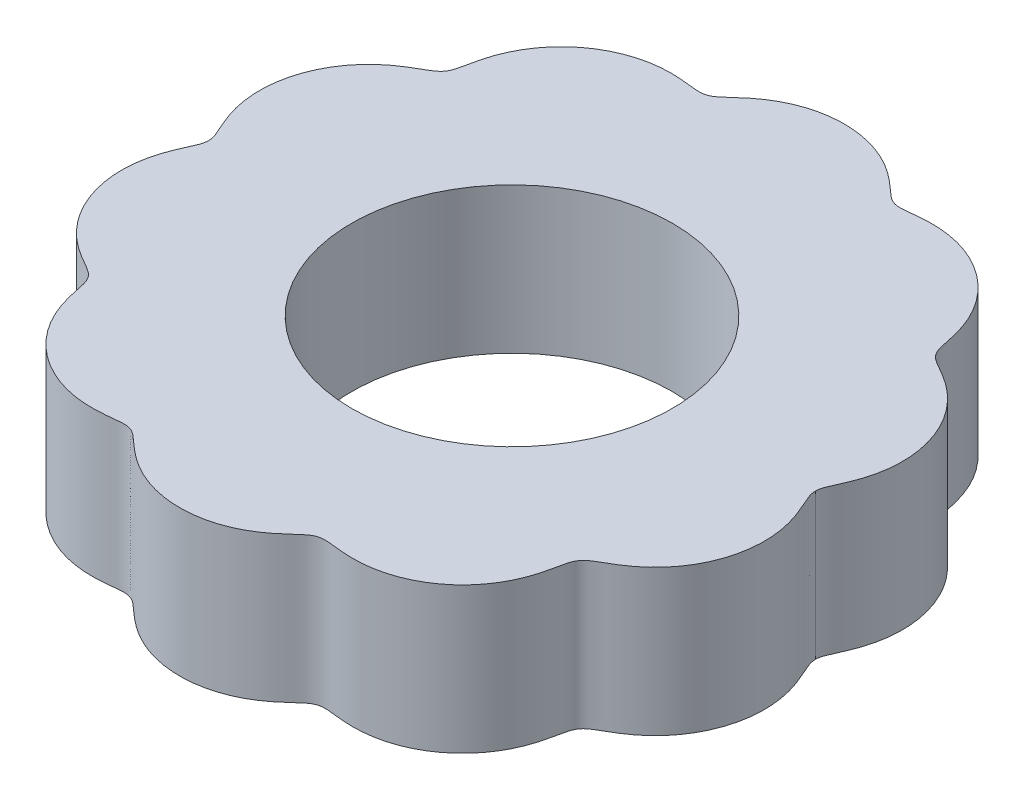
ISO-10303-21;
HEADER;
FILE_DESCRIPTION(('STEP AP214'),'2;1');
FILE_NAME('part.step','',(''),(''),'','','');
FILE_SCHEMA(('AUTOMOTIVE_DESIGN { 1 0 10303 214 1 1 1 1 }'));
ENDSEC;
DATA;
#1=APPLICATION_CONTEXT('core data for automotive mechanical design processes');
#2=APPLICATION_PROTOCOL_DEFINITION('international standard','automotive_design',2000,#1);
#3=PRODUCT_CONTEXT('',#1,'mechanical');
#4=PRODUCT('Part','Part','',(#3));
#5=PRODUCT_RELATED_PRODUCT_CATEGORY('part','',(#4));
#6=PRODUCT_DEFINITION_FORMATION('','',#4);
#7=PRODUCT_DEFINITION_CONTEXT('part definition',#1,'design');
#8=PRODUCT_DEFINITION('design','',#6,#7);
#9=PRODUCT_DEFINITION_SHAPE('','',#8);
#10=(LENGTH_UNIT() NAMED_UNIT(*) SI_UNIT(.MILLI.,.METRE.));
#11=(NAMED_UNIT(*) PLANE_ANGLE_UNIT() SI_UNIT($,.RADIAN.));
#12=(NAMED_UNIT(*) SI_UNIT($,.STERADIAN.) SOLID_ANGLE_UNIT());
#13=UNCERTAINTY_MEASURE_WITH_UNIT(LENGTH_MEASURE(1.E-05),#10,'distance_accuracy_value','');
#14=(GEOMETRIC_REPRESENTATION_CONTEXT(3) GLOBAL_UNCERTAINTY_ASSIGNED_CONTEXT((#13)) GLOBAL_UNIT_ASSIGNED_CONTEXT((#10,
#11,#12)) REPRESENTATION_CONTEXT('',''));
#15=CARTESIAN_POINT('',(0.,0.,0.));
#16=DIRECTION('',(0.,0.,1.));
#17=DIRECTION('',(1.,0.,0.));
#18=AXIS2_PLACEMENT_3D('',#15,#16,#17);
#19=CARTESIAN_POINT('',(5.66684015251145E-12,10.,-22.7883664956999));
#20=DIRECTION('',(0.,1.,0.));
#21=DIRECTION('',(0.,0.,1.));
#22=AXIS2_PLACEMENT_3D('',#19,#20,#21);
#23=PLANE('',#22);
#24=CARTESIAN_POINT('',(20.8067679925084,10.,-1.63520338886232E-12));
#25=CARTESIAN_POINT('',(20.8067679925078,10.,-0.015142641797084));
#26=CARTESIAN_POINT('',(20.8074459774196,10.,-0.045422111758798));
#27=CARTESIAN_POINT('',(20.8104967894709,10.,-0.101151179960891));
#28=CARTESIAN_POINT('',(20.8184744507347,10.,-0.177358341262578));
#29=CARTESIAN_POINT('',(20.8319629497627,10.,-0.259520889695984));
#30=CARTESIAN_POINT('',(20.8525886694335,10.,-0.349573849901697));
#31=CARTESIAN_POINT('',(20.8815267767094,10.,-0.451500736003869));
#32=CARTESIAN_POINT('',(20.9192025977906,10.,-0.562382339841655));
#33=CARTESIAN_POINT('',(20.9658297458358,10.,-0.684471511318826));
#34=CARTESIAN_POINT('',(21.0213820991405,10.,-0.817888401491453));
#35=CARTESIAN_POINT('',(21.1024865182805,10.,-1.002051141951));
#36=CARTESIAN_POINT('',(21.2094352724943,10.,-1.23679753622529));
#37=CARTESIAN_POINT('',(21.3325587921468,10.,-1.51142885910751));
#38=CARTESIAN_POINT('',(21.4658598575531,10.,-1.82972903763051));
#39=CARTESIAN_POINT('',(21.5885596633047,10.,-2.15344072985761));
#40=CARTESIAN_POINT('',(21.7261817113759,10.,-2.5654522000879));
#41=CARTESIAN_POINT('',(21.9087987324381,10.,-3.23811434449116));
#42=CARTESIAN_POINT('',(22.060487753189,10.,-4.18699596203511));
#43=CARTESIAN_POINT('',(22.0629557377847,10.,-5.41301173494125));
#44=CARTESIAN_POINT('',(21.8061406788307,10.,-6.79027756252468));
#45=CARTESIAN_POINT('',(21.2998248933342,10.,-8.09657400756305));
#46=CARTESIAN_POINT('',(20.6532054522824,10.,-9.13815182138678));
#47=CARTESIAN_POINT('',(19.9684059129657,10.,-9.93188531002493));
#48=CARTESIAN_POINT('',(19.3216417158311,10.,-10.5165123846235));
#49=CARTESIAN_POINT('',(18.7641927993596,10.,-10.9355528735426));
#50=CARTESIAN_POINT('',(18.2755739009553,10.,-11.2436120443366));
#51=CARTESIAN_POINT('',(17.8778579408087,10.,-11.4701885561434));
#52=CARTESIAN_POINT('',(17.5838384701983,10.,-11.6375824775753));
#53=CARTESIAN_POINT('',(17.3952430973813,10.,-11.7488794732935));
#54=CARTESIAN_POINT('',(17.1919077459155,10.,-11.880467666607));
#55=CARTESIAN_POINT('',(16.9884628000711,10.,-12.0383276451734));
#56=CARTESIAN_POINT('',(16.820704227002,10.,-12.2258054774244));
#57=CARTESIAN_POINT('',(16.7031065164294,10.,-12.4381274031403));
#58=CARTESIAN_POINT('',(16.6196016858624,10.,-12.6554209138856));
#59=CARTESIAN_POINT('',(16.5568074120891,10.,-12.8792748427124));
#60=CARTESIAN_POINT('',(16.4861280909376,10.,-13.1950651556938));
#61=CARTESIAN_POINT('',(16.4153749207067,10.,-13.55195609372));
#62=CARTESIAN_POINT('',(16.3339416299163,10.,-13.9248782930563));
#63=CARTESIAN_POINT('',(16.2121857201326,10.,-14.3961359264571));
#64=CARTESIAN_POINT('',(16.0035673460356,10.,-15.0610920566378));
#65=CARTESIAN_POINT('',(15.6235832312715,10.,-15.9435752994152));
#66=CARTESIAN_POINT('',(14.9693457359635,10.,-16.9805391151679));
#67=CARTESIAN_POINT('',(14.0146511460604,10.,-18.0059189802402));
#68=CARTESIAN_POINT('',(12.8871185150953,10.,-18.8375206441668));
#69=CARTESIAN_POINT('',(11.6255590248755,10.,-19.4468174468248));
#70=CARTESIAN_POINT('',(10.4416876538523,10.,-19.7658029054535));
#71=CARTESIAN_POINT('',(9.39947367330984,10.,-19.8775125185284));
#72=CARTESIAN_POINT('',(8.62966355194429,10.,-19.868490697556));
#73=CARTESIAN_POINT('',(8.13759447558625,10.,-19.8322350007661));
#74=CARTESIAN_POINT('',(7.74820560088718,10.,-19.7912331314415));
#75=CARTESIAN_POINT('',(7.46010934839673,10.,-19.7583516466727));
#76=CARTESIAN_POINT('',(7.19476106452213,10.,-19.7312752036086));
#77=CARTESIAN_POINT('',(6.9511678251272,10.,-19.7172944694113));
#78=CARTESIAN_POINT('',(6.71030070997161,10.,-19.7244256225398));
#79=CARTESIAN_POINT('',(6.46952933325209,10.,-19.7635978771723));
#80=CARTESIAN_POINT('',(6.21260808565255,10.,-19.8667077198203));
#81=CARTESIAN_POINT('',(5.95874785720263,10.,-20.0391836225169));
#82=CARTESIAN_POINT('',(5.7120914630989,10.,-20.2478205584174));
#83=CARTESIAN_POINT('',(5.46419459470255,10.,-20.4745625241737));
#84=CARTESIAN_POINT('',(5.21148595258185,10.,-20.7049544788743));
#85=CARTESIAN_POINT('',(4.94889193491785,10.,-20.9338594546238));
#86=CARTESIAN_POINT('',(4.47665208956766,10.,-21.319166800972));
#87=CARTESIAN_POINT('',(3.90256204870384,10.,-21.7161485357291));
#88=CARTESIAN_POINT('',(3.21132355820731,10.,-22.0908707302004));
#89=CARTESIAN_POINT('',(2.23690445444412,10.,-22.4717454361274));
#90=CARTESIAN_POINT('',(1.2206103584705,10.,-22.7289059865781));
#91=CARTESIAN_POINT('',(-8.60007554470875E-12,10.,-22.8423859032007));
#92=CARTESIAN_POINT('',(-1.22061035842393,10.,-22.7289059865845));
#93=CARTESIAN_POINT('',(-2.23690445446525,10.,-22.4717454361175));
#94=CARTESIAN_POINT('',(-3.21132355812847,10.,-22.0908707302273));
#95=CARTESIAN_POINT('',(-3.90256204881995,10.,-21.7161485356773));
#96=CARTESIAN_POINT('',(-4.47665208935464,10.,-21.3191668010601));
#97=CARTESIAN_POINT('',(-4.94889193516014,10.,-20.9338594545162));
#98=CARTESIAN_POINT('',(-5.21148595189823,10.,-20.704954479169));
#99=CARTESIAN_POINT('',(-5.46419459593766,10.,-20.4745625236337));
#100=CARTESIAN_POINT('',(-5.71209146106738,10.,-20.2478205593));
#101=CARTESIAN_POINT('',(-5.95874785979843,10.,-20.0391836213845));
#102=CARTESIAN_POINT('',(-6.21260808198656,10.,-19.8667077214155));
#103=CARTESIAN_POINT('',(-6.46952933861475,10.,-19.7635978748349));
#104=CARTESIAN_POINT('',(-6.71030070129916,10.,-19.7244256263163));
#105=CARTESIAN_POINT('',(-6.95116784263204,10.,-19.7172944617848));
#106=CARTESIAN_POINT('',(-7.19476102324161,10.,-19.7312752215903));
#107=CARTESIAN_POINT('',(-7.46010943452566,10.,-19.7583516091523));
#108=CARTESIAN_POINT('',(-7.74820547474974,10.,-19.7912331863893));
#109=CARTESIAN_POINT('',(-8.13759469243758,10.,-19.8322349063002));
#110=CARTESIAN_POINT('',(-8.62966321512628,10.,-19.8684908442821));
#111=CARTESIAN_POINT('',(-9.39947423928293,10.,-19.8775122719773));
#112=CARTESIAN_POINT('',(-10.441686787604,10.,-19.7658032828136));
#113=CARTESIAN_POINT('',(-11.6255603424744,10.,-19.4468168728488));
#114=CARTESIAN_POINT('',(-12.8871166601667,10.,-18.8375214522217));
#115=CARTESIAN_POINT('',(-14.0146540922068,10.,-18.0059176968315));
#116=CARTESIAN_POINT('',(-14.9693405743981,10.,-16.9805413636759));
#117=CARTESIAN_POINT('',(-15.6235919014054,10.,-15.9435715225006));
#118=CARTESIAN_POINT('',(-16.0035541308571,10.,-15.0610978134958));
#119=CARTESIAN_POINT('',(-16.2122059495066,10.,-14.3961271140586));
#120=CARTESIAN_POINT('',(-16.3338934267941,10.,-13.9248992915099));
#121=CARTESIAN_POINT('',(-16.4154827120947,10.,-13.5519091371894));
#122=CARTESIAN_POINT('',(-16.485956353287,10.,-13.1951399687781));
#123=CARTESIAN_POINT('',(-16.567291077056,10.,-12.8334016610617));
#124=CARTESIAN_POINT('',(-16.6521536903321,10.,-12.5436790192258));
#125=CARTESIAN_POINT('',(-16.7888941723063,10.,-12.2612046957626));
#126=CARTESIAN_POINT('',(-16.9885880860537,10.,-12.0382730675751));
#127=CARTESIAN_POINT('',(-17.1918235144063,10.,-11.8805043598991));
#128=CARTESIAN_POINT('',(-17.3952939332278,10.,-11.7488573279766));
#129=CARTESIAN_POINT('',(-17.5838143652439,10.,-11.6375929782853));
#130=CARTESIAN_POINT('',(-17.8778729399917,10.,-11.4701820221445));
#131=CARTESIAN_POINT('',(-18.2755642253102,10.,-11.2436162592913));
#132=CARTESIAN_POINT('',(-18.7641982737732,10.,-10.9355504887637));
#133=CARTESIAN_POINT('',(-19.3216393245595,10.,-10.5165134263304));
#134=CARTESIAN_POINT('',(-19.968407324126,10.,-9.93188469529752));
#135=CARTESIAN_POINT('',(-20.6532045398571,10.,-9.13815221887607));
#136=CARTESIAN_POINT('',(-21.2998254730706,10.,-8.09657375502145));
#137=CARTESIAN_POINT('',(-21.8061403253688,10.,-6.79027771652254));
#138=CARTESIAN_POINT('',(-22.0629559904282,10.,-5.41301162488144));
#139=CARTESIAN_POINT('',(-22.0604875794565,10.,-4.18699603775559));
#140=CARTESIAN_POINT('',(-21.9087988352429,10.,-3.23811429968211));
#141=CARTESIAN_POINT('',(-21.7261816554898,10.,-2.56545222450633));
#142=CARTESIAN_POINT('',(-21.5885597000024,10.,-2.15344071375162));
#143=CARTESIAN_POINT('',(-21.4658598310535,10.,-1.82972904949845));
#144=CARTESIAN_POINT('',(-21.3325588111325,10.,-1.51142885023687));
#145=CARTESIAN_POINT('',(-21.2094352608319,10.,-1.2367975423645));
#146=CARTESIAN_POINT('',(-21.1024865245388,10.,-1.00205113761977));
#147=CARTESIAN_POINT('',(-21.0213820965282,10.,-0.817888404320629));
#148=CARTESIAN_POINT('',(-20.9658297465082,10.,-0.684471519148974));
#149=CARTESIAN_POINT('',(-20.9192025982995,10.,-0.562382295944169));
#150=CARTESIAN_POINT('',(-20.8815267752552,10.,-0.451500834165947));
#151=CARTESIAN_POINT('',(-20.8525886684401,10.,-0.349573916405096));
#152=CARTESIAN_POINT('',(-20.8319629598938,10.,-0.259520211385822));
#153=CARTESIAN_POINT('',(-20.8184744436377,10.,-0.177358816696612));
#154=CARTESIAN_POINT('',(-20.8104967392619,10.,-0.101154543553295));
#155=CARTESIAN_POINT('',(-20.8074459476462,10.,-0.0454241016360806));
#156=CARTESIAN_POINT('',(-20.8067679925075,10.,-0.0151426418005498));
#157=CARTESIAN_POINT('',(-20.8067679925084,10.,-1.63520338886232E-12));
#158=B_SPLINE_CURVE_WITH_KNOTS('',4,(#24,#25,#26,#27,#28,#29,#30,#31,#32,#33,#34,#35,#36,#37,
#38,#39,#40,#41,#42,#43,#44,#45,#46,#47,#48,#49,#50,#51,#52,#53,#54,#55,#56,#57,#58,#59,#60,#61,
#62,#63,#64,#65,#66,#67,#68,#69,#70,#71,#72,#73,#74,#75,#76,#77,#78,#79,#80,#81,#82,#83,#84,#85,
#86,#87,#88,#89,#90,#91,#92,#93,#94,#95,#96,#97,#98,#99,#100,#101,#102,#103,#104,#105,#106,#107,
#108,#109,#110,#111,#112,#113,#114,#115,#116,#117,#118,#119,#120,#121,#122,#123,#124,#125,#126,
#127,#128,#129,#130,#131,#132,#133,#134,#135,#136,#137,#138,#139,#140,#141,#142,#143,#144,#145,
#146,#147,#148,#149,#150,#151,#152,#153,#154,#155,#156,#157),.UNSPECIFIED.,.F.,.F.,(5,1,1,1,1,1,
1,1,1,1,1,1,1,1,1,1,1,1,1,1,1,1,1,1,1,1,1,1,1,1,1,1,1,1,1,1,1,1,1,1,1,1,1,1,1,1,1,1,1,1,1,1,1,1,
1,1,1,1,1,1,1,1,1,1,1,1,1,1,1,1,1,1,1,1,1,1,1,1,1,1,1,1,1,1,1,1,1,1,1,1,1,1,1,1,1,1,1,1,1,1,1,1,
1,1,1,1,1,1,1,1,1,1,1,1,1,1,1,1,1,1,1,1,1,1,1,1,1,1,1,1,5),(0.0731542810817081,
0.073986106444982,0.0748179318082558,0.0756497571715297,0.0764815825348036,0.0778532052391005,
0.0792248279433975,0.0805964506476945,0.0819680733519915,0.0839842902170327,0.0860005070820739,
0.0900329408121563,0.0940653745422388,0.0980978082723212,0.102180825026714,0.106263841781107,
0.114429875289892,0.130760532182345,0.147091512160641,0.163422734916475,0.17975409294214,
0.196085254667151,0.20425061249046,0.21241597031377,0.220581503556144,0.228747036798519,
0.231314033622615,0.233881030446711,0.236448027270807,0.239015024094903,0.242667302061646,
0.245929484397663,0.248129117310502,0.250328750223341,0.253573043824184,0.256817337425028,
0.263305924626715,0.26738870212809,0.271471479629466,0.279637034632217,0.295968276201372,
0.312299455407048,0.328630599590859,0.344961884747518,0.36129319033568,0.377623681957752,
0.385789547685196,0.39395541341264,0.397354308728355,0.400753204044071,0.404152099359786,
0.407550994675502,0.409866145853582,0.412181297031662,0.415443232938286,0.418926969663654,
0.422718530566487,0.42651009146932,0.430592992211454,0.434675892953587,0.43875879369572,
0.442841694437853,0.459171879103264,0.467337552178363,0.475503225253462,0.491834446008902,
0.5081655539911,0.52449677474654,0.532662447821639,0.540828120896738,0.557158305562149,
0.561241206304282,0.565324107046415,0.569407007788548,0.573489908530682,0.577281469433514,
0.581073030336346,0.584556767061714,0.587818702968338,0.590133854146418,0.592449005324499,
0.595847900640215,0.59924679595593,0.602645691271646,0.606044586587362,0.614210452314806,
0.62237631804225,0.638706809664322,0.655038115252484,0.671369400409144,0.687700544592954,
0.70403172379863,0.720362965367786,0.728528520370537,0.732611297871912,0.736694075373288,
0.743182662574974,0.746426956175817,0.74967124977666,0.754070515602337,0.757332697938354,
0.760984975905098,0.763551972729195,0.766118969553292,0.768685966377389,0.771252963201486,
0.77941849644386,0.787584029686235,0.795749387509544,0.803914745332853,0.820245907057865,
0.83657726508353,0.852908487839363,0.869239467817659,0.885570124710112,0.893736158218898,
0.897819174973291,0.901902191727683,0.905934625457765,0.909967059187847,0.913999492917929,
0.91601570978297,0.918031926648011,0.919403549352308,0.920775172056605,0.922146794760901,
0.923518417465198,0.924350242828472,0.925182068191746,0.92601389355502,0.926845718918294),.UNSPECIFIED.);
#159=CARTESIAN_POINT('',(20.8067679925084,10.,-3.85610245661064E-11));
#160=VERTEX_POINT('',#159);
#161=CARTESIAN_POINT('',(-20.8067679925084,10.,-5.24123721909416E-11));
#162=VERTEX_POINT('',#161);
#163=EDGE_CURVE('E65',#160,#162,#158,.T.);
#164=ORIENTED_EDGE('',*,*,#163,.T.);
#165=CARTESIAN_POINT('',(-20.8067679925084,10.,-5.24123721909416E-11));
#166=CARTESIAN_POINT('',(-20.8067679925075,10.,0.0151426417486878));
#167=CARTESIAN_POINT('',(-20.8074459476464,10.,0.0454241015854037));
#168=CARTESIAN_POINT('',(-20.8104967392628,10.,0.101154543505194));
#169=CARTESIAN_POINT('',(-20.8184744436398,10.,0.177358816651168));
#170=CARTESIAN_POINT('',(-20.8319629598969,10.,0.259520211340221));
#171=CARTESIAN_POINT('',(-20.8525886684442,10.,0.349573916359255));
#172=CARTESIAN_POINT('',(-20.8815267752604,10.,0.45150083411977));
#173=CARTESIAN_POINT('',(-20.919202598306,10.,0.562382295897554));
#174=CARTESIAN_POINT('',(-20.9658297465162,10.,0.684471519101818));
#175=CARTESIAN_POINT('',(-21.0213820965377,10.,0.817888404272827));
#176=CARTESIAN_POINT('',(-21.1024865245505,10.,1.00205113757102));
#177=CARTESIAN_POINT('',(-21.2094352608463,10.,1.23679754231451));
#178=CARTESIAN_POINT('',(-21.3325588111501,10.,1.51142885018545));
#179=CARTESIAN_POINT('',(-21.4658598310748,10.,1.82972904944548));
#180=CARTESIAN_POINT('',(-21.5885597000274,10.,2.15344071369723));
#181=CARTESIAN_POINT('',(-21.7261816555197,10.,2.56545222445034));
#182=CARTESIAN_POINT('',(-21.9087988352805,10.,3.238114299624));
#183=CARTESIAN_POINT('',(-22.0604875795052,10.,4.18699603769571));
#184=CARTESIAN_POINT('',(-22.0629559904911,10.,5.41301162482153));
#185=CARTESIAN_POINT('',(-21.8061403254477,10.,6.79027771646562));
#186=CARTESIAN_POINT('',(-21.2998254731647,10.,8.09657375497041));
#187=CARTESIAN_POINT('',(-20.6532045399633,10.,9.13815221883255));
#188=CARTESIAN_POINT('',(-19.9684073242415,10.,9.93188469526196));
#189=CARTESIAN_POINT('',(-19.3216393246817,10.,10.5165134263023));
#190=CARTESIAN_POINT('',(-18.7641982739003,10.,10.9355504887422));
#191=CARTESIAN_POINT('',(-18.2755642254408,10.,11.2436162592754));
#192=CARTESIAN_POINT('',(-17.8778729401249,10.,11.4701820221333));
#193=CARTESIAN_POINT('',(-17.5838143653791,10.,11.6375929782774));
#194=CARTESIAN_POINT('',(-17.3952939333643,10.,11.7488573279709));
#195=CARTESIAN_POINT('',(-17.1918235145443,10.,11.8805043598958));
#196=CARTESIAN_POINT('',(-16.9885880861936,10.,12.0382730675741));
#197=CARTESIAN_POINT('',(-16.7888941724488,10.,12.261204695764));
#198=CARTESIAN_POINT('',(-16.6521536904779,10.,12.5436790192288));
#199=CARTESIAN_POINT('',(-16.5672910772051,10.,12.8334016610657));
#200=CARTESIAN_POINT('',(-16.4859563534403,10.,13.195139968783));
#201=CARTESIAN_POINT('',(-16.4154827122522,10.,13.5519091371951));
#202=CARTESIAN_POINT('',(-16.3338934269559,10.,13.9248992915165));
#203=CARTESIAN_POINT('',(-16.2122059496739,10.,14.3961271140667));
#204=CARTESIAN_POINT('',(-16.0035541310321,10.,15.0610978135063));
#205=CARTESIAN_POINT('',(-15.6235919015907,10.,15.9435715225155));
#206=CARTESIAN_POINT('',(-14.9693405745954,10.,16.9805413636984));
#207=CARTESIAN_POINT('',(-14.014654092416,10.,18.0059176968651));
#208=CARTESIAN_POINT('',(-12.8871166603856,10.,18.8375214522684));
#209=CARTESIAN_POINT('',(-11.6255603427004,10.,19.4468168729102));
#210=CARTESIAN_POINT('',(-10.4416867878337,10.,19.7658032828887));
#211=CARTESIAN_POINT('',(-9.39947423951389,10.,19.8775122720645));
#212=CARTESIAN_POINT('',(-8.62966321535713,10.,19.8684908443783));
#213=CARTESIAN_POINT('',(-8.13759469266801,10.,19.832234906402));
#214=CARTESIAN_POINT('',(-7.7482054749797,10.,19.7912331864957));
#215=CARTESIAN_POINT('',(-7.46010943475523,10.,19.758351609262));
#216=CARTESIAN_POINT('',(-7.19476102347087,10.,19.7312752217031));
#217=CARTESIAN_POINT('',(-6.95116784286114,10.,19.7172944619004));
#218=CARTESIAN_POINT('',(-6.71030070152835,10.,19.7244256264348));
#219=CARTESIAN_POINT('',(-6.46952933884439,10.,19.7635978749562));
#220=CARTESIAN_POINT('',(-6.2126080822174,10.,19.8667077215398));
#221=CARTESIAN_POINT('',(-5.95874786003127,10.,20.0391836215118));
#222=CARTESIAN_POINT('',(-5.71209146130264,10.,20.2478205594301));
#223=CARTESIAN_POINT('',(-5.46419459617556,10.,20.4745625237667));
#224=CARTESIAN_POINT('',(-5.21148595213881,10.,20.7049544793049));
#225=CARTESIAN_POINT('',(-4.94889193540337,10.,20.9338594546551));
#226=CARTESIAN_POINT('',(-4.47665208960235,10.,21.3191668012045));
#227=CARTESIAN_POINT('',(-3.90256204907227,10.,21.7161485358284));
#228=CARTESIAN_POINT('',(-3.21132355838515,10.,22.0908707303864));
#229=CARTESIAN_POINT('',(-2.23690445472635,10.,22.4717454362879));
#230=CARTESIAN_POINT('',(-1.22061035868803,10.,22.7289059867668));
#231=CARTESIAN_POINT('',(-2.74012066119955E-10,10.,22.8423859033971));
#232=CARTESIAN_POINT('',(1.2206103582064,10.,22.7289059867887));
#233=CARTESIAN_POINT('',(2.23690445418301,10.,22.4717454363499));
#234=CARTESIAN_POINT('',(3.21132355795063,10.,22.0908707304341));
#235=CARTESIAN_POINT('',(3.90256204845151,10.,21.7161485359709));
#236=CARTESIAN_POINT('',(4.47665208931994,10.,21.3191668012204));
#237=CARTESIAN_POINT('',(4.94889193467461,10.,20.9338594548777));
#238=CARTESIAN_POINT('',(5.21148595234127,10.,20.7049544791313));
#239=CARTESIAN_POINT('',(5.46419459446466,10.,20.4745625244337));
#240=CARTESIAN_POINT('',(5.71209146286363,10.,20.2478205586802));
#241=CARTESIAN_POINT('',(5.95874785696978,10.,20.0391836227826));
#242=CARTESIAN_POINT('',(6.21260808542172,10.,19.866707720089));
#243=CARTESIAN_POINT('',(6.46952933302245,10.,19.7635978774439));
#244=CARTESIAN_POINT('',(6.71030070974243,10.,19.7244256228142));
#245=CARTESIAN_POINT('',(6.9511678248981,10.,19.7172944696885));
#246=CARTESIAN_POINT('',(7.19476106429287,10.,19.7312752038887));
#247=CARTESIAN_POINT('',(7.46010934816715,10.,19.7583516469559));
#248=CARTESIAN_POINT('',(7.74820560065722,10.,19.7912331317279));
#249=CARTESIAN_POINT('',(8.13759447535581,10.,19.8322350010571));
#250=CARTESIAN_POINT('',(8.62966355171343,10.,19.8684906978527));
#251=CARTESIAN_POINT('',(9.39947367307888,10.,19.8775125188341));
#252=CARTESIAN_POINT('',(10.4416876536226,10.,19.7658029057713));
#253=CARTESIAN_POINT('',(11.6255590246496,10.,19.4468174471563));
#254=CARTESIAN_POINT('',(12.8871185148765,10.,18.8375206445129));
#255=CARTESIAN_POINT('',(14.0146511458512,10.,18.0059189805994));
#256=CARTESIAN_POINT('',(14.9693457357662,10.,16.9805391155383));
#257=CARTESIAN_POINT('',(15.6235832310863,10.,15.9435752997932));
#258=CARTESIAN_POINT('',(16.0035673458606,10.,15.0610920570202));
#259=CARTESIAN_POINT('',(16.2121857199653,10.,14.3961359268419));
#260=CARTESIAN_POINT('',(16.3339416297545,10.,13.9248782934426));
#261=CARTESIAN_POINT('',(16.4153749205492,10.,13.5519560941071));
#262=CARTESIAN_POINT('',(16.4861280907843,10.,13.1950651560818));
#263=CARTESIAN_POINT('',(16.5568074119395,10.,12.8792748431013));
#264=CARTESIAN_POINT('',(16.6196016857154,10.,12.6554209142752));
#265=CARTESIAN_POINT('',(16.7031065162849,10.,12.4381274035308));
#266=CARTESIAN_POINT('',(16.8207042268599,10.,12.2258054778163));
#267=CARTESIAN_POINT('',(16.9884627999312,10.,12.0383276455672));
#268=CARTESIAN_POINT('',(17.1919077457775,10.,11.8804676670033));
#269=CARTESIAN_POINT('',(17.3952430972448,10.,11.7488794736921));
#270=CARTESIAN_POINT('',(17.5838384700631,10.,11.637582477976));
#271=CARTESIAN_POINT('',(17.8778579406755,10.,11.4701885565476));
#272=CARTESIAN_POINT('',(18.2755739008247,10.,11.2436120447454));
#273=CARTESIAN_POINT('',(18.7641927992325,10.,10.935552873957));
#274=CARTESIAN_POINT('',(19.3216417157089,10.,10.5165123850445));
#275=CARTESIAN_POINT('',(19.9684059128503,10.,9.93188531045339));
#276=CARTESIAN_POINT('',(20.6532054521762,10.,9.1381518218232));
#277=CARTESIAN_POINT('',(21.2998248932401,10.,8.09657400800699));
#278=CARTESIAN_POINT('',(21.8061406787518,10.,6.79027756297449));
#279=CARTESIAN_POINT('',(22.0629557377218,10.,5.41301173539405));
#280=CARTESIAN_POINT('',(22.0604877531404,10.,4.18699596248788));
#281=CARTESIAN_POINT('',(21.9087987324005,10.,3.23811434494217));
#282=CARTESIAN_POINT('',(21.7261817113461,10.,2.56545220053679));
#283=CARTESIAN_POINT('',(21.5885596632797,10.,2.1534407303049));
#284=CARTESIAN_POINT('',(21.4658598575318,10.,1.82972903807638));
#285=CARTESIAN_POINT('',(21.3325587921292,10.,1.51142885955182));
#286=CARTESIAN_POINT('',(21.2094352724799,10.,1.23679753666817));
#287=CARTESIAN_POINT('',(21.1024865182688,10.,1.00205114239265));
#288=CARTESIAN_POINT('',(21.021382099131,10.,0.817888401932151));
#289=CARTESIAN_POINT('',(20.9658297458278,10.,0.684471511758878));
#290=CARTESIAN_POINT('',(20.9192025977841,10.,0.562382340281166));
#291=CARTESIAN_POINT('',(20.8815267767042,10.,0.451500736442942));
#292=CARTESIAN_POINT('',(20.8525886694295,10.,0.349573850340434));
#293=CARTESIAN_POINT('',(20.8319629497597,10.,0.259520890134481));
#294=CARTESIAN_POINT('',(20.8184744507327,10.,0.177358341700918));
#295=CARTESIAN_POINT('',(20.810496789454,10.,0.101151180248663));
#296=CARTESIAN_POINT('',(20.807445977403,10.,0.0454221119035694));
#297=CARTESIAN_POINT('',(20.8067679924996,10.,0.0151426418765568));
#298=CARTESIAN_POINT('',(20.8067679925084,10.,-3.85610245661064E-11));
#299=B_SPLINE_CURVE_WITH_KNOTS('',4,(#165,#166,#167,#168,#169,#170,#171,#172,#173,#174,#175,
#176,#177,#178,#179,#180,#181,#182,#183,#184,#185,#186,#187,#188,#189,#190,#191,#192,#193,#194,
#195,#196,#197,#198,#199,#200,#201,#202,#203,#204,#205,#206,#207,#208,#209,#210,#211,#212,#213,
#214,#215,#216,#217,#218,#219,#220,#221,#222,#223,#224,#225,#226,#227,#228,#229,#230,#231,#232,
#233,#234,#235,#236,#237,#238,#239,#240,#241,#242,#243,#244,#245,#246,#247,#248,#249,#250,#251,
#252,#253,#254,#255,#256,#257,#258,#259,#260,#261,#262,#263,#264,#265,#266,#267,#268,#269,#270,
#271,#272,#273,#274,#275,#276,#277,#278,#279,#280,#281,#282,#283,#284,#285,#286,#287,#288,#289,
#290,#291,#292,#293,#294,#295,#296,#297,#298),.UNSPECIFIED.,.F.,.F.,(5,1,1,1,1,1,1,1,1,1,1,1,1,
1,1,1,1,1,1,1,1,1,1,1,1,1,1,1,1,1,1,1,1,1,1,1,1,1,1,1,1,1,1,1,1,1,1,1,1,1,1,1,1,1,1,1,1,1,1,1,1,
1,1,1,1,1,1,1,1,1,1,1,1,1,1,1,1,1,1,1,1,1,1,1,1,1,1,1,1,1,1,1,1,1,1,1,1,1,1,1,1,1,1,1,1,1,1,1,1,
1,1,1,1,1,1,1,1,1,1,1,1,1,1,1,1,1,1,1,1,1,5),(0.0731542810817081,0.0739861064449822,
0.0748179318082563,0.0756497571715304,0.0764815825348045,0.0778532052391012,0.0792248279433979,
0.0805964506476947,0.0819680733519914,0.0839842902170323,0.0860005070820734,0.0900329408121552,
0.0940653745422371,0.0980978082723191,0.102180825026712,0.106263841781105,0.11442987528989,
0.130760532182343,0.147091512160639,0.163422734916473,0.179754092942138,0.196085254667149,
0.204250612490458,0.212415970313768,0.220581503556142,0.228747036798517,0.231314033622614,
0.233881030446711,0.236448027270808,0.239015024094905,0.242667302061649,0.245929484397666,
0.250328750223343,0.253573043824186,0.256817337425029,0.263305924626715,0.26738870212809,
0.271471479629466,0.279637034632217,0.295968276201372,0.312299455407048,0.328630599590859,
0.344961884747518,0.36129319033568,0.377623681957752,0.385789547685196,0.39395541341264,
0.397354308728356,0.400753204044072,0.404152099359788,0.407550994675504,0.409866145853584,
0.412181297031665,0.415443232938288,0.418926969663656,0.422718530566489,0.426510091469321,
0.430592992211454,0.434675892953587,0.438758793695721,0.442841694437854,0.459171879103264,
0.467337552178363,0.475503225253463,0.491834446008903,0.5081655539911,0.52449677474654,
0.53266244782164,0.540828120896739,0.557158305562149,0.561241206304282,0.565324107046416,
0.569407007788549,0.573489908530682,0.577281469433515,0.581073030336348,0.584556767061717,
0.587818702968341,0.590133854146421,0.592449005324501,0.595847900640216,0.599246795955932,
0.602645691271647,0.606044586587362,0.614210452314806,0.62237631804225,0.638706809664322,
0.655038115252484,0.671369400409144,0.687700544592954,0.70403172379863,0.720362965367786,
0.728528520370537,0.732611297871912,0.736694075373288,0.743182662574975,0.746426956175818,
0.749671249776662,0.751870882689501,0.754070515602339,0.757332697938356,0.760984975905099,
0.763551972729195,0.766118969553291,0.768685966377387,0.771252963201483,0.779418496443858,
0.787584029686233,0.795749387509542,0.803914745332851,0.820245907057863,0.836577265083528,
0.852908487839361,0.869239467817657,0.88557012471011,0.893736158218896,0.897819174973288,
0.901902191727681,0.905934625457764,0.909967059187846,0.913999492917928,0.91601570978297,
0.918031926648011,0.919403549352308,0.920775172056605,0.922146794760902,0.923518417465199,
0.924350242828473,0.925182068191747,0.92601389355502,0.926845718918294),.UNSPECIFIED.);
#300=EDGE_CURVE('E50',#162,#160,#299,.T.);
#301=ORIENTED_EDGE('',*,*,#300,.T.);
#302=EDGE_LOOP('',(#164,#301));
#303=FACE_BOUND('',#302,.T.);
#304=CARTESIAN_POINT('',(0.,10.,0.));
#305=DIRECTION('',(0.,1.,0.));
#306=DIRECTION('',(0.,0.,1.));
#307=AXIS2_PLACEMENT_3D('',#304,#305,#306);
#308=CIRCLE('',#307,11.);
#309=CARTESIAN_POINT('',(0.,10.,11.));
#310=VERTEX_POINT('',#309);
#311=EDGE_CURVE('E71',#310,#310,#308,.T.);
#312=ORIENTED_EDGE('',*,*,#311,.F.);
#313=EDGE_LOOP('',(#312));
#314=FACE_BOUND('',#313,.T.);
#315=ADVANCED_FACE('F33',(#303,#314),#23,.T.);
#316=CARTESIAN_POINT('',(5.66684015251145E-12,0.,-22.7883664956999));
#317=DIRECTION('',(0.,1.,0.));
#318=DIRECTION('',(0.,0.,1.));
#319=AXIS2_PLACEMENT_3D('',#316,#317,#318);
#320=PLANE('',#319);
#321=CARTESIAN_POINT('',(20.8067679925084,0.,-1.63520338886232E-12));
#322=CARTESIAN_POINT('',(20.8067679925078,0.,-0.015142641797084));
#323=CARTESIAN_POINT('',(20.8074459774196,0.,-0.045422111758798));
#324=CARTESIAN_POINT('',(20.8104967894709,0.,-0.101151179960891));
#325=CARTESIAN_POINT('',(20.8184744507347,0.,-0.177358341262578));
#326=CARTESIAN_POINT('',(20.8319629497627,0.,-0.259520889695984));
#327=CARTESIAN_POINT('',(20.8525886694335,0.,-0.349573849901697));
#328=CARTESIAN_POINT('',(20.8815267767094,0.,-0.451500736003869));
#329=CARTESIAN_POINT('',(20.9192025977906,0.,-0.562382339841655));
#330=CARTESIAN_POINT('',(20.9658297458358,0.,-0.684471511318826));
#331=CARTESIAN_POINT('',(21.0213820991405,0.,-0.817888401491453));
#332=CARTESIAN_POINT('',(21.1024865182805,0.,-1.002051141951));
#333=CARTESIAN_POINT('',(21.2094352724943,0.,-1.23679753622529));
#334=CARTESIAN_POINT('',(21.3325587921468,0.,-1.51142885910751));
#335=CARTESIAN_POINT('',(21.4658598575531,0.,-1.82972903763051));
#336=CARTESIAN_POINT('',(21.5885596633047,0.,-2.15344072985761));
#337=CARTESIAN_POINT('',(21.7261817113759,0.,-2.5654522000879));
#338=CARTESIAN_POINT('',(21.9087987324381,0.,-3.23811434449116));
#339=CARTESIAN_POINT('',(22.060487753189,0.,-4.18699596203511));
#340=CARTESIAN_POINT('',(22.0629557377847,0.,-5.41301173494125));
#341=CARTESIAN_POINT('',(21.8061406788307,0.,-6.79027756252468));
#342=CARTESIAN_POINT('',(21.2998248933342,0.,-8.09657400756305));
#343=CARTESIAN_POINT('',(20.6532054522824,0.,-9.13815182138678));
#344=CARTESIAN_POINT('',(19.9684059129657,0.,-9.93188531002493));
#345=CARTESIAN_POINT('',(19.3216417158311,0.,-10.5165123846235));
#346=CARTESIAN_POINT('',(18.7641927993596,0.,-10.9355528735426));
#347=CARTESIAN_POINT('',(18.2755739009553,0.,-11.2436120443366));
#348=CARTESIAN_POINT('',(17.8778579408087,0.,-11.4701885561434));
#349=CARTESIAN_POINT('',(17.5838384701983,0.,-11.6375824775753));
#350=CARTESIAN_POINT('',(17.3952430973813,0.,-11.7488794732935));
#351=CARTESIAN_POINT('',(17.1919077459155,0.,-11.880467666607));
#352=CARTESIAN_POINT('',(16.9884628000711,0.,-12.0383276451734));
#353=CARTESIAN_POINT('',(16.820704227002,0.,-12.2258054774244));
#354=CARTESIAN_POINT('',(16.7031065164294,0.,-12.4381274031403));
#355=CARTESIAN_POINT('',(16.6196016858624,0.,-12.6554209138856));
#356=CARTESIAN_POINT('',(16.5568074120891,0.,-12.8792748427124));
#357=CARTESIAN_POINT('',(16.4861280909376,0.,-13.1950651556938));
#358=CARTESIAN_POINT('',(16.4153749207067,0.,-13.55195609372));
#359=CARTESIAN_POINT('',(16.3339416299163,0.,-13.9248782930563));
#360=CARTESIAN_POINT('',(16.2121857201326,0.,-14.3961359264571));
#361=CARTESIAN_POINT('',(16.0035673460356,0.,-15.0610920566378));
#362=CARTESIAN_POINT('',(15.6235832312715,0.,-15.9435752994152));
#363=CARTESIAN_POINT('',(14.9693457359635,0.,-16.9805391151679));
#364=CARTESIAN_POINT('',(14.0146511460604,0.,-18.0059189802402));
#365=CARTESIAN_POINT('',(12.8871185150953,0.,-18.8375206441668));
#366=CARTESIAN_POINT('',(11.6255590248755,0.,-19.4468174468248));
#367=CARTESIAN_POINT('',(10.4416876538523,0.,-19.7658029054535));
#368=CARTESIAN_POINT('',(9.39947367330984,0.,-19.8775125185284));
#369=CARTESIAN_POINT('',(8.62966355194429,0.,-19.868490697556));
#370=CARTESIAN_POINT('',(8.13759447558625,0.,-19.8322350007661));
#371=CARTESIAN_POINT('',(7.74820560088718,0.,-19.7912331314415));
#372=CARTESIAN_POINT('',(7.46010934839673,0.,-19.7583516466727));
#373=CARTESIAN_POINT('',(7.19476106452213,0.,-19.7312752036086));
#374=CARTESIAN_POINT('',(6.9511678251272,0.,-19.7172944694113));
#375=CARTESIAN_POINT('',(6.71030070997161,0.,-19.7244256225398));
#376=CARTESIAN_POINT('',(6.46952933325209,0.,-19.7635978771723));
#377=CARTESIAN_POINT('',(6.21260808565255,0.,-19.8667077198203));
#378=CARTESIAN_POINT('',(5.95874785720263,0.,-20.0391836225169));
#379=CARTESIAN_POINT('',(5.7120914630989,0.,-20.2478205584174));
#380=CARTESIAN_POINT('',(5.46419459470255,0.,-20.4745625241737));
#381=CARTESIAN_POINT('',(5.21148595258185,0.,-20.7049544788743));
#382=CARTESIAN_POINT('',(4.94889193491785,0.,-20.9338594546238));
#383=CARTESIAN_POINT('',(4.47665208956766,0.,-21.319166800972));
#384=CARTESIAN_POINT('',(3.90256204870384,0.,-21.7161485357291));
#385=CARTESIAN_POINT('',(3.21132355820731,0.,-22.0908707302004));
#386=CARTESIAN_POINT('',(2.23690445444412,0.,-22.4717454361274));
#387=CARTESIAN_POINT('',(1.2206103584705,0.,-22.7289059865781));
#388=CARTESIAN_POINT('',(-8.60007554470875E-12,0.,-22.8423859032007));
#389=CARTESIAN_POINT('',(-1.22061035842393,0.,-22.7289059865845));
#390=CARTESIAN_POINT('',(-2.23690445446525,0.,-22.4717454361175));
#391=CARTESIAN_POINT('',(-3.21132355812847,0.,-22.0908707302273));
#392=CARTESIAN_POINT('',(-3.90256204881995,0.,-21.7161485356773));
#393=CARTESIAN_POINT('',(-4.47665208935464,0.,-21.3191668010601));
#394=CARTESIAN_POINT('',(-4.94889193516014,0.,-20.9338594545162));
#395=CARTESIAN_POINT('',(-5.21148595189823,0.,-20.704954479169));
#396=CARTESIAN_POINT('',(-5.46419459593766,0.,-20.4745625236337));
#397=CARTESIAN_POINT('',(-5.71209146106738,0.,-20.2478205593));
#398=CARTESIAN_POINT('',(-5.95874785979843,0.,-20.0391836213845));
#399=CARTESIAN_POINT('',(-6.21260808198656,0.,-19.8667077214155));
#400=CARTESIAN_POINT('',(-6.46952933861475,0.,-19.7635978748349));
#401=CARTESIAN_POINT('',(-6.71030070129916,0.,-19.7244256263163));
#402=CARTESIAN_POINT('',(-6.95116784263204,0.,-19.7172944617848));
#403=CARTESIAN_POINT('',(-7.19476102324161,0.,-19.7312752215903));
#404=CARTESIAN_POINT('',(-7.46010943452566,0.,-19.7583516091523));
#405=CARTESIAN_POINT('',(-7.74820547474974,0.,-19.7912331863893));
#406=CARTESIAN_POINT('',(-8.13759469243758,0.,-19.8322349063002));
#407=CARTESIAN_POINT('',(-8.62966321512628,0.,-19.8684908442821));
#408=CARTESIAN_POINT('',(-9.39947423928293,0.,-19.8775122719773));
#409=CARTESIAN_POINT('',(-10.441686787604,0.,-19.7658032828136));
#410=CARTESIAN_POINT('',(-11.6255603424744,0.,-19.4468168728488));
#411=CARTESIAN_POINT('',(-12.8871166601667,0.,-18.8375214522217));
#412=CARTESIAN_POINT('',(-14.0146540922068,0.,-18.0059176968315));
#413=CARTESIAN_POINT('',(-14.9693405743981,0.,-16.9805413636759));
#414=CARTESIAN_POINT('',(-15.6235919014054,0.,-15.9435715225006));
#415=CARTESIAN_POINT('',(-16.0035541308571,0.,-15.0610978134958));
#416=CARTESIAN_POINT('',(-16.2122059495066,0.,-14.3961271140586));
#417=CARTESIAN_POINT('',(-16.3338934267941,0.,-13.9248992915099));
#418=CARTESIAN_POINT('',(-16.4154827120947,0.,-13.5519091371894));
#419=CARTESIAN_POINT('',(-16.485956353287,0.,-13.1951399687781));
#420=CARTESIAN_POINT('',(-16.567291077056,0.,-12.8334016610617));
#421=CARTESIAN_POINT('',(-16.6521536903321,0.,-12.5436790192258));
#422=CARTESIAN_POINT('',(-16.7888941723063,0.,-12.2612046957626));
#423=CARTESIAN_POINT('',(-16.9885880860537,0.,-12.0382730675751));
#424=CARTESIAN_POINT('',(-17.1918235144063,0.,-11.8805043598991));
#425=CARTESIAN_POINT('',(-17.3952939332278,0.,-11.7488573279766));
#426=CARTESIAN_POINT('',(-17.5838143652439,0.,-11.6375929782853));
#427=CARTESIAN_POINT('',(-17.8778729399917,0.,-11.4701820221445));
#428=CARTESIAN_POINT('',(-18.2755642253102,0.,-11.2436162592913));
#429=CARTESIAN_POINT('',(-18.7641982737732,0.,-10.9355504887637));
#430=CARTESIAN_POINT('',(-19.3216393245595,0.,-10.5165134263304));
#431=CARTESIAN_POINT('',(-19.968407324126,0.,-9.93188469529752));
#432=CARTESIAN_POINT('',(-20.6532045398571,0.,-9.13815221887607));
#433=CARTESIAN_POINT('',(-21.2998254730706,0.,-8.09657375502145));
#434=CARTESIAN_POINT('',(-21.8061403253688,0.,-6.79027771652254));
#435=CARTESIAN_POINT('',(-22.0629559904282,0.,-5.41301162488144));
#436=CARTESIAN_POINT('',(-22.0604875794565,0.,-4.18699603775559));
#437=CARTESIAN_POINT('',(-21.9087988352429,0.,-3.23811429968211));
#438=CARTESIAN_POINT('',(-21.7261816554898,0.,-2.56545222450633));
#439=CARTESIAN_POINT('',(-21.5885597000024,0.,-2.15344071375162));
#440=CARTESIAN_POINT('',(-21.4658598310535,0.,-1.82972904949845));
#441=CARTESIAN_POINT('',(-21.3325588111325,0.,-1.51142885023687));
#442=CARTESIAN_POINT('',(-21.2094352608319,0.,-1.2367975423645));
#443=CARTESIAN_POINT('',(-21.1024865245388,0.,-1.00205113761977));
#444=CARTESIAN_POINT('',(-21.0213820965282,0.,-0.817888404320629));
#445=CARTESIAN_POINT('',(-20.9658297465082,0.,-0.684471519148974));
#446=CARTESIAN_POINT('',(-20.9192025982995,0.,-0.562382295944169));
#447=CARTESIAN_POINT('',(-20.8815267752552,0.,-0.451500834165947));
#448=CARTESIAN_POINT('',(-20.8525886684401,0.,-0.349573916405096));
#449=CARTESIAN_POINT('',(-20.8319629598938,0.,-0.259520211385822));
#450=CARTESIAN_POINT('',(-20.8184744436377,0.,-0.177358816696612));
#451=CARTESIAN_POINT('',(-20.8104967392619,0.,-0.101154543553295));
#452=CARTESIAN_POINT('',(-20.8074459476462,0.,-0.0454241016360806));
#453=CARTESIAN_POINT('',(-20.8067679925075,0.,-0.0151426418005498));
#454=CARTESIAN_POINT('',(-20.8067679925084,0.,-1.63520338886232E-12));
#455=B_SPLINE_CURVE_WITH_KNOTS('',4,(#321,#322,#323,#324,#325,#326,#327,#328,#329,#330,#331,
#332,#333,#334,#335,#336,#337,#338,#339,#340,#341,#342,#343,#344,#345,#346,#347,#348,#349,#350,
#351,#352,#353,#354,#355,#356,#357,#358,#359,#360,#361,#362,#363,#364,#365,#366,#367,#368,#369,
#370,#371,#372,#373,#374,#375,#376,#377,#378,#379,#380,#381,#382,#383,#384,#385,#386,#387,#388,
#389,#390,#391,#392,#393,#394,#395,#396,#397,#398,#399,#400,#401,#402,#403,#404,#405,#406,#407,
#408,#409,#410,#411,#412,#413,#414,#415,#416,#417,#418,#419,#420,#421,#422,#423,#424,#425,#426,
#427,#428,#429,#430,#431,#432,#433,#434,#435,#436,#437,#438,#439,#440,#441,#442,#443,#444,#445,
#446,#447,#448,#449,#450,#451,#452,#453,#454),.UNSPECIFIED.,.F.,.F.,(5,1,1,1,1,1,1,1,1,1,1,1,1,
1,1,1,1,1,1,1,1,1,1,1,1,1,1,1,1,1,1,1,1,1,1,1,1,1,1,1,1,1,1,1,1,1,1,1,1,1,1,1,1,1,1,1,1,1,1,1,1,
1,1,1,1,1,1,1,1,1,1,1,1,1,1,1,1,1,1,1,1,1,1,1,1,1,1,1,1,1,1,1,1,1,1,1,1,1,1,1,1,1,1,1,1,1,1,1,1,
1,1,1,1,1,1,1,1,1,1,1,1,1,1,1,1,1,1,1,1,1,5),(0.0731542810817081,0.073986106444982,
0.0748179318082558,0.0756497571715297,0.0764815825348036,0.0778532052391005,0.0792248279433975,
0.0805964506476945,0.0819680733519915,0.0839842902170327,0.0860005070820739,0.0900329408121563,
0.0940653745422388,0.0980978082723212,0.102180825026714,0.106263841781107,0.114429875289892,
0.130760532182345,0.147091512160641,0.163422734916475,0.17975409294214,0.196085254667151,
0.20425061249046,0.21241597031377,0.220581503556144,0.228747036798519,0.231314033622615,
0.233881030446711,0.236448027270807,0.239015024094903,0.242667302061646,0.245929484397663,
0.248129117310502,0.250328750223341,0.253573043824184,0.256817337425028,0.263305924626715,
0.26738870212809,0.271471479629466,0.279637034632217,0.295968276201372,0.312299455407048,
0.328630599590859,0.344961884747518,0.36129319033568,0.377623681957752,0.385789547685196,
0.39395541341264,0.397354308728355,0.400753204044071,0.404152099359786,0.407550994675502,
0.409866145853582,0.412181297031662,0.415443232938286,0.418926969663654,0.422718530566487,
0.42651009146932,0.430592992211454,0.434675892953587,0.43875879369572,0.442841694437853,
0.459171879103264,0.467337552178363,0.475503225253462,0.491834446008902,0.5081655539911,
0.52449677474654,0.532662447821639,0.540828120896738,0.557158305562149,0.561241206304282,
0.565324107046415,0.569407007788548,0.573489908530682,0.577281469433514,0.581073030336346,
0.584556767061714,0.587818702968338,0.590133854146418,0.592449005324499,0.595847900640215,
0.59924679595593,0.602645691271646,0.606044586587362,0.614210452314806,0.62237631804225,
0.638706809664322,0.655038115252484,0.671369400409144,0.687700544592954,0.70403172379863,
0.720362965367786,0.728528520370537,0.732611297871912,0.736694075373288,0.743182662574974,
0.746426956175817,0.74967124977666,0.754070515602337,0.757332697938354,0.760984975905098,
0.763551972729195,0.766118969553292,0.768685966377389,0.771252963201486,0.77941849644386,
0.787584029686235,0.795749387509544,0.803914745332853,0.820245907057865,0.83657726508353,
0.852908487839363,0.869239467817659,0.885570124710112,0.893736158218898,0.897819174973291,
0.901902191727683,0.905934625457765,0.909967059187847,0.913999492917929,0.91601570978297,
0.918031926648011,0.919403549352308,0.920775172056605,0.922146794760901,0.923518417465198,
0.924350242828472,0.925182068191746,0.92601389355502,0.926845718918294),.UNSPECIFIED.);
#456=CARTESIAN_POINT('',(20.8067679925084,0.,-3.85610245661064E-11));
#457=VERTEX_POINT('',#456);
#458=CARTESIAN_POINT('',(-20.8067679925084,0.,-5.24123721909416E-11));
#459=VERTEX_POINT('',#458);
#460=EDGE_CURVE('E66',#457,#459,#455,.T.);
#461=ORIENTED_EDGE('',*,*,#460,.F.);
#462=CARTESIAN_POINT('',(-20.8067679925084,0.,-5.24123721909416E-11));
#463=CARTESIAN_POINT('',(-20.8067679925075,0.,0.0151426417486878));
#464=CARTESIAN_POINT('',(-20.8074459476464,0.,0.0454241015854037));
#465=CARTESIAN_POINT('',(-20.8104967392628,0.,0.101154543505194));
#466=CARTESIAN_POINT('',(-20.8184744436398,0.,0.177358816651168));
#467=CARTESIAN_POINT('',(-20.8319629598969,0.,0.259520211340221));
#468=CARTESIAN_POINT('',(-20.8525886684442,0.,0.349573916359255));
#469=CARTESIAN_POINT('',(-20.8815267752604,0.,0.45150083411977));
#470=CARTESIAN_POINT('',(-20.919202598306,0.,0.562382295897554));
#471=CARTESIAN_POINT('',(-20.9658297465162,0.,0.684471519101818));
#472=CARTESIAN_POINT('',(-21.0213820965377,0.,0.817888404272827));
#473=CARTESIAN_POINT('',(-21.1024865245505,0.,1.00205113757102));
#474=CARTESIAN_POINT('',(-21.2094352608463,0.,1.23679754231451));
#475=CARTESIAN_POINT('',(-21.3325588111501,0.,1.51142885018545));
#476=CARTESIAN_POINT('',(-21.4658598310748,0.,1.82972904944548));
#477=CARTESIAN_POINT('',(-21.5885597000274,0.,2.15344071369723));
#478=CARTESIAN_POINT('',(-21.7261816555197,0.,2.56545222445034));
#479=CARTESIAN_POINT('',(-21.9087988352805,0.,3.238114299624));
#480=CARTESIAN_POINT('',(-22.0604875795052,0.,4.18699603769571));
#481=CARTESIAN_POINT('',(-22.0629559904911,0.,5.41301162482153));
#482=CARTESIAN_POINT('',(-21.8061403254477,0.,6.79027771646562));
#483=CARTESIAN_POINT('',(-21.2998254731647,0.,8.09657375497041));
#484=CARTESIAN_POINT('',(-20.6532045399633,0.,9.13815221883255));
#485=CARTESIAN_POINT('',(-19.9684073242415,0.,9.93188469526196));
#486=CARTESIAN_POINT('',(-19.3216393246817,0.,10.5165134263023));
#487=CARTESIAN_POINT('',(-18.7641982739003,0.,10.9355504887422));
#488=CARTESIAN_POINT('',(-18.2755642254408,0.,11.2436162592754));
#489=CARTESIAN_POINT('',(-17.8778729401249,0.,11.4701820221333));
#490=CARTESIAN_POINT('',(-17.5838143653791,0.,11.6375929782774));
#491=CARTESIAN_POINT('',(-17.3952939333643,0.,11.7488573279709));
#492=CARTESIAN_POINT('',(-17.1918235145443,0.,11.8805043598958));
#493=CARTESIAN_POINT('',(-16.9885880861936,0.,12.0382730675741));
#494=CARTESIAN_POINT('',(-16.7888941724488,0.,12.261204695764));
#495=CARTESIAN_POINT('',(-16.6521536904779,0.,12.5436790192288));
#496=CARTESIAN_POINT('',(-16.5672910772051,0.,12.8334016610657));
#497=CARTESIAN_POINT('',(-16.4859563534403,0.,13.195139968783));
#498=CARTESIAN_POINT('',(-16.4154827122522,0.,13.5519091371951));
#499=CARTESIAN_POINT('',(-16.3338934269559,0.,13.9248992915165));
#500=CARTESIAN_POINT('',(-16.2122059496739,0.,14.3961271140667));
#501=CARTESIAN_POINT('',(-16.0035541310321,0.,15.0610978135063));
#502=CARTESIAN_POINT('',(-15.6235919015907,0.,15.9435715225155));
#503=CARTESIAN_POINT('',(-14.9693405745954,0.,16.9805413636984));
#504=CARTESIAN_POINT('',(-14.014654092416,0.,18.0059176968651));
#505=CARTESIAN_POINT('',(-12.8871166603856,0.,18.8375214522684));
#506=CARTESIAN_POINT('',(-11.6255603427004,0.,19.4468168729102));
#507=CARTESIAN_POINT('',(-10.4416867878337,0.,19.7658032828887));
#508=CARTESIAN_POINT('',(-9.39947423951389,0.,19.8775122720645));
#509=CARTESIAN_POINT('',(-8.62966321535713,0.,19.8684908443783));
#510=CARTESIAN_POINT('',(-8.13759469266801,0.,19.832234906402));
#511=CARTESIAN_POINT('',(-7.7482054749797,0.,19.7912331864957));
#512=CARTESIAN_POINT('',(-7.46010943475523,0.,19.758351609262));
#513=CARTESIAN_POINT('',(-7.19476102347087,0.,19.7312752217031));
#514=CARTESIAN_POINT('',(-6.95116784286114,0.,19.7172944619004));
#515=CARTESIAN_POINT('',(-6.71030070152835,0.,19.7244256264348));
#516=CARTESIAN_POINT('',(-6.46952933884439,0.,19.7635978749562));
#517=CARTESIAN_POINT('',(-6.2126080822174,0.,19.8667077215398));
#518=CARTESIAN_POINT('',(-5.95874786003127,0.,20.0391836215118));
#519=CARTESIAN_POINT('',(-5.71209146130264,0.,20.2478205594301));
#520=CARTESIAN_POINT('',(-5.46419459617556,0.,20.4745625237667));
#521=CARTESIAN_POINT('',(-5.21148595213881,0.,20.7049544793049));
#522=CARTESIAN_POINT('',(-4.94889193540337,0.,20.9338594546551));
#523=CARTESIAN_POINT('',(-4.47665208960235,0.,21.3191668012045));
#524=CARTESIAN_POINT('',(-3.90256204907227,0.,21.7161485358284));
#525=CARTESIAN_POINT('',(-3.21132355838515,0.,22.0908707303864));
#526=CARTESIAN_POINT('',(-2.23690445472635,0.,22.4717454362879));
#527=CARTESIAN_POINT('',(-1.22061035868803,0.,22.7289059867668));
#528=CARTESIAN_POINT('',(-2.74012066119955E-10,0.,22.8423859033971));
#529=CARTESIAN_POINT('',(1.2206103582064,0.,22.7289059867887));
#530=CARTESIAN_POINT('',(2.23690445418301,0.,22.4717454363499));
#531=CARTESIAN_POINT('',(3.21132355795063,0.,22.0908707304341));
#532=CARTESIAN_POINT('',(3.90256204845151,0.,21.7161485359709));
#533=CARTESIAN_POINT('',(4.47665208931994,0.,21.3191668012204));
#534=CARTESIAN_POINT('',(4.94889193467461,0.,20.9338594548777));
#535=CARTESIAN_POINT('',(5.21148595234127,0.,20.7049544791313));
#536=CARTESIAN_POINT('',(5.46419459446466,0.,20.4745625244337));
#537=CARTESIAN_POINT('',(5.71209146286363,0.,20.2478205586802));
#538=CARTESIAN_POINT('',(5.95874785696978,0.,20.0391836227826));
#539=CARTESIAN_POINT('',(6.21260808542172,0.,19.866707720089));
#540=CARTESIAN_POINT('',(6.46952933302245,0.,19.7635978774439));
#541=CARTESIAN_POINT('',(6.71030070974243,0.,19.7244256228142));
#542=CARTESIAN_POINT('',(6.9511678248981,0.,19.7172944696885));
#543=CARTESIAN_POINT('',(7.19476106429287,0.,19.7312752038887));
#544=CARTESIAN_POINT('',(7.46010934816715,0.,19.7583516469559));
#545=CARTESIAN_POINT('',(7.74820560065722,0.,19.7912331317279));
#546=CARTESIAN_POINT('',(8.13759447535581,0.,19.8322350010571));
#547=CARTESIAN_POINT('',(8.62966355171343,0.,19.8684906978527));
#548=CARTESIAN_POINT('',(9.39947367307888,0.,19.8775125188341));
#549=CARTESIAN_POINT('',(10.4416876536226,0.,19.7658029057713));
#550=CARTESIAN_POINT('',(11.6255590246496,0.,19.4468174471563));
#551=CARTESIAN_POINT('',(12.8871185148765,0.,18.8375206445129));
#552=CARTESIAN_POINT('',(14.0146511458512,0.,18.0059189805994));
#553=CARTESIAN_POINT('',(14.9693457357662,0.,16.9805391155383));
#554=CARTESIAN_POINT('',(15.6235832310863,0.,15.9435752997932));
#555=CARTESIAN_POINT('',(16.0035673458606,0.,15.0610920570202));
#556=CARTESIAN_POINT('',(16.2121857199653,0.,14.3961359268419));
#557=CARTESIAN_POINT('',(16.3339416297545,0.,13.9248782934426));
#558=CARTESIAN_POINT('',(16.4153749205492,0.,13.5519560941071));
#559=CARTESIAN_POINT('',(16.4861280907843,0.,13.1950651560818));
#560=CARTESIAN_POINT('',(16.5568074119395,0.,12.8792748431013));
#561=CARTESIAN_POINT('',(16.6196016857154,0.,12.6554209142752));
#562=CARTESIAN_POINT('',(16.7031065162849,0.,12.4381274035308));
#563=CARTESIAN_POINT('',(16.8207042268599,0.,12.2258054778163));
#564=CARTESIAN_POINT('',(16.9884627999312,0.,12.0383276455672));
#565=CARTESIAN_POINT('',(17.1919077457775,0.,11.8804676670033));
#566=CARTESIAN_POINT('',(17.3952430972448,0.,11.7488794736921));
#567=CARTESIAN_POINT('',(17.5838384700631,0.,11.637582477976));
#568=CARTESIAN_POINT('',(17.8778579406755,0.,11.4701885565476));
#569=CARTESIAN_POINT('',(18.2755739008247,0.,11.2436120447454));
#570=CARTESIAN_POINT('',(18.7641927992325,0.,10.935552873957));
#571=CARTESIAN_POINT('',(19.3216417157089,0.,10.5165123850445));
#572=CARTESIAN_POINT('',(19.9684059128503,0.,9.93188531045339));
#573=CARTESIAN_POINT('',(20.6532054521762,0.,9.1381518218232));
#574=CARTESIAN_POINT('',(21.2998248932401,0.,8.09657400800699));
#575=CARTESIAN_POINT('',(21.8061406787518,0.,6.79027756297449));
#576=CARTESIAN_POINT('',(22.0629557377218,0.,5.41301173539405));
#577=CARTESIAN_POINT('',(22.0604877531404,0.,4.18699596248788));
#578=CARTESIAN_POINT('',(21.9087987324005,0.,3.23811434494217));
#579=CARTESIAN_POINT('',(21.7261817113461,0.,2.56545220053679));
#580=CARTESIAN_POINT('',(21.5885596632797,0.,2.1534407303049));
#581=CARTESIAN_POINT('',(21.4658598575318,0.,1.82972903807638));
#582=CARTESIAN_POINT('',(21.3325587921292,0.,1.51142885955182));
#583=CARTESIAN_POINT('',(21.2094352724799,0.,1.23679753666817));
#584=CARTESIAN_POINT('',(21.1024865182688,0.,1.00205114239265));
#585=CARTESIAN_POINT('',(21.021382099131,0.,0.817888401932151));
#586=CARTESIAN_POINT('',(20.9658297458278,0.,0.684471511758878));
#587=CARTESIAN_POINT('',(20.9192025977841,0.,0.562382340281166));
#588=CARTESIAN_POINT('',(20.8815267767042,0.,0.451500736442942));
#589=CARTESIAN_POINT('',(20.8525886694295,0.,0.349573850340434));
#590=CARTESIAN_POINT('',(20.8319629497597,0.,0.259520890134481));
#591=CARTESIAN_POINT('',(20.8184744507327,0.,0.177358341700918));
#592=CARTESIAN_POINT('',(20.810496789454,0.,0.101151180248663));
#593=CARTESIAN_POINT('',(20.807445977403,0.,0.0454221119035694));
#594=CARTESIAN_POINT('',(20.8067679924996,0.,0.0151426418765568));
#595=CARTESIAN_POINT('',(20.8067679925084,0.,-3.85610245661064E-11));
#596=B_SPLINE_CURVE_WITH_KNOTS('',4,(#462,#463,#464,#465,#466,#467,#468,#469,#470,#471,#472,
#473,#474,#475,#476,#477,#478,#479,#480,#481,#482,#483,#484,#485,#486,#487,#488,#489,#490,#491,
#492,#493,#494,#495,#496,#497,#498,#499,#500,#501,#502,#503,#504,#505,#506,#507,#508,#509,#510,
#511,#512,#513,#514,#515,#516,#517,#518,#519,#520,#521,#522,#523,#524,#525,#526,#527,#528,#529,
#530,#531,#532,#533,#534,#535,#536,#537,#538,#539,#540,#541,#542,#543,#544,#545,#546,#547,#548,
#549,#550,#551,#552,#553,#554,#555,#556,#557,#558,#559,#560,#561,#562,#563,#564,#565,#566,#567,
#568,#569,#570,#571,#572,#573,#574,#575,#576,#577,#578,#579,#580,#581,#582,#583,#584,#585,#586,
#587,#588,#589,#590,#591,#592,#593,#594,#595),.UNSPECIFIED.,.F.,.F.,(5,1,1,1,1,1,1,1,1,1,1,1,1,
1,1,1,1,1,1,1,1,1,1,1,1,1,1,1,1,1,1,1,1,1,1,1,1,1,1,1,1,1,1,1,1,1,1,1,1,1,1,1,1,1,1,1,1,1,1,1,1,
1,1,1,1,1,1,1,1,1,1,1,1,1,1,1,1,1,1,1,1,1,1,1,1,1,1,1,1,1,1,1,1,1,1,1,1,1,1,1,1,1,1,1,1,1,1,1,1,
1,1,1,1,1,1,1,1,1,1,1,1,1,1,1,1,1,1,1,1,1,5),(0.0731542810817081,0.0739861064449822,
0.0748179318082563,0.0756497571715304,0.0764815825348045,0.0778532052391012,0.0792248279433979,
0.0805964506476947,0.0819680733519914,0.0839842902170323,0.0860005070820734,0.0900329408121552,
0.0940653745422371,0.0980978082723191,0.102180825026712,0.106263841781105,0.11442987528989,
0.130760532182343,0.147091512160639,0.163422734916473,0.179754092942138,0.196085254667149,
0.204250612490458,0.212415970313768,0.220581503556142,0.228747036798517,0.231314033622614,
0.233881030446711,0.236448027270808,0.239015024094905,0.242667302061649,0.245929484397666,
0.250328750223343,0.253573043824186,0.256817337425029,0.263305924626715,0.26738870212809,
0.271471479629466,0.279637034632217,0.295968276201372,0.312299455407048,0.328630599590859,
0.344961884747518,0.36129319033568,0.377623681957752,0.385789547685196,0.39395541341264,
0.397354308728356,0.400753204044072,0.404152099359788,0.407550994675504,0.409866145853584,
0.412181297031665,0.415443232938288,0.418926969663656,0.422718530566489,0.426510091469321,
0.430592992211454,0.434675892953587,0.438758793695721,0.442841694437854,0.459171879103264,
0.467337552178363,0.475503225253463,0.491834446008903,0.5081655539911,0.52449677474654,
0.53266244782164,0.540828120896739,0.557158305562149,0.561241206304282,0.565324107046416,
0.569407007788549,0.573489908530682,0.577281469433515,0.581073030336348,0.584556767061717,
0.587818702968341,0.590133854146421,0.592449005324501,0.595847900640216,0.599246795955932,
0.602645691271647,0.606044586587362,0.614210452314806,0.62237631804225,0.638706809664322,
0.655038115252484,0.671369400409144,0.687700544592954,0.70403172379863,0.720362965367786,
0.728528520370537,0.732611297871912,0.736694075373288,0.743182662574975,0.746426956175818,
0.749671249776662,0.751870882689501,0.754070515602339,0.757332697938356,0.760984975905099,
0.763551972729195,0.766118969553291,0.768685966377387,0.771252963201483,0.779418496443858,
0.787584029686233,0.795749387509542,0.803914745332851,0.820245907057863,0.836577265083528,
0.852908487839361,0.869239467817657,0.88557012471011,0.893736158218896,0.897819174973288,
0.901902191727681,0.905934625457764,0.909967059187846,0.913999492917928,0.91601570978297,
0.918031926648011,0.919403549352308,0.920775172056605,0.922146794760902,0.923518417465199,
0.924350242828473,0.925182068191747,0.92601389355502,0.926845718918294),.UNSPECIFIED.);
#597=EDGE_CURVE('E58',#459,#457,#596,.T.);
#598=ORIENTED_EDGE('',*,*,#597,.F.);
#599=EDGE_LOOP('',(#461,#598));
#600=FACE_BOUND('',#599,.T.);
#601=CARTESIAN_POINT('',(0.,0.,0.));
#602=DIRECTION('',(0.,1.,0.));
#603=DIRECTION('',(0.,0.,1.));
#604=AXIS2_PLACEMENT_3D('',#601,#602,#603);
#605=CIRCLE('',#604,11.);
#606=CARTESIAN_POINT('',(0.,0.,11.));
#607=VERTEX_POINT('',#606);
#608=EDGE_CURVE('E74',#607,#607,#605,.T.);
#609=ORIENTED_EDGE('',*,*,#608,.T.);
#610=EDGE_LOOP('',(#609));
#611=FACE_BOUND('',#610,.T.);
#612=ADVANCED_FACE('F69',(#600,#611),#320,.F.);
#613=DIRECTION('',(0.,-1.,0.));
#614=VECTOR('',#613,1.);
#615=SURFACE_OF_LINEAR_EXTRUSION('',#158,#614);
#616=ORIENTED_EDGE('',*,*,#460,.T.);
#617=DIRECTION('',(0.,-1.,0.));
#618=VECTOR('',#617,1.);
#619=CARTESIAN_POINT('',(-20.8067679925084,10.,-5.24123721909416E-11));
#620=LINE('',#619,#618);
#621=EDGE_CURVE('E11',#162,#459,#620,.T.);
#622=ORIENTED_EDGE('',*,*,#621,.F.);
#623=ORIENTED_EDGE('',*,*,#163,.F.);
#624=DIRECTION('',(0.,-1.,0.));
#625=VECTOR('',#624,1.);
#626=CARTESIAN_POINT('',(20.8067679925084,10.,-3.85610245661064E-11));
#627=LINE('',#626,#625);
#628=EDGE_CURVE('E43',#160,#457,#627,.T.);
#629=ORIENTED_EDGE('',*,*,#628,.T.);
#630=EDGE_LOOP('',(#616,#622,#623,#629));
#631=FACE_BOUND('',#630,.T.);
#632=ADVANCED_FACE('F35',(#631),#615,.F.);
#633=DIRECTION('',(0.,-1.,0.));
#634=VECTOR('',#633,1.);
#635=SURFACE_OF_LINEAR_EXTRUSION('',#299,#634);
#636=ORIENTED_EDGE('',*,*,#597,.T.);
#637=ORIENTED_EDGE('',*,*,#628,.F.);
#638=ORIENTED_EDGE('',*,*,#300,.F.);
#639=ORIENTED_EDGE('',*,*,#621,.T.);
#640=EDGE_LOOP('',(#636,#637,#638,#639));
#641=FACE_BOUND('',#640,.T.);
#642=ADVANCED_FACE('F61',(#641),#635,.F.);
#643=CARTESIAN_POINT('',(0.,10.,0.));
#644=DIRECTION('',(0.,-1.,0.));
#645=DIRECTION('',(0.,0.,-1.));
#646=AXIS2_PLACEMENT_3D('',#643,#644,#645);
#647=CYLINDRICAL_SURFACE('',#646,11.);
#648=ORIENTED_EDGE('',*,*,#311,.T.);
#649=EDGE_LOOP('',(#648));
#650=FACE_BOUND('',#649,.T.);
#651=ORIENTED_EDGE('',*,*,#608,.F.);
#652=EDGE_LOOP('',(#651));
#653=FACE_BOUND('',#652,.T.);
#654=ADVANCED_FACE('F99',(#650,#653),#647,.F.);
#655=CLOSED_SHELL('',(#315,#612,#632,#642,#654));
#656=MANIFOLD_SOLID_BREP('B2',#655);
#657=ADVANCED_BREP_SHAPE_REPRESENTATION('',(#18,#656),#14);
#658=SHAPE_DEFINITION_REPRESENTATION(#9,#657);
ENDSEC;
END-ISO-10303-21;
